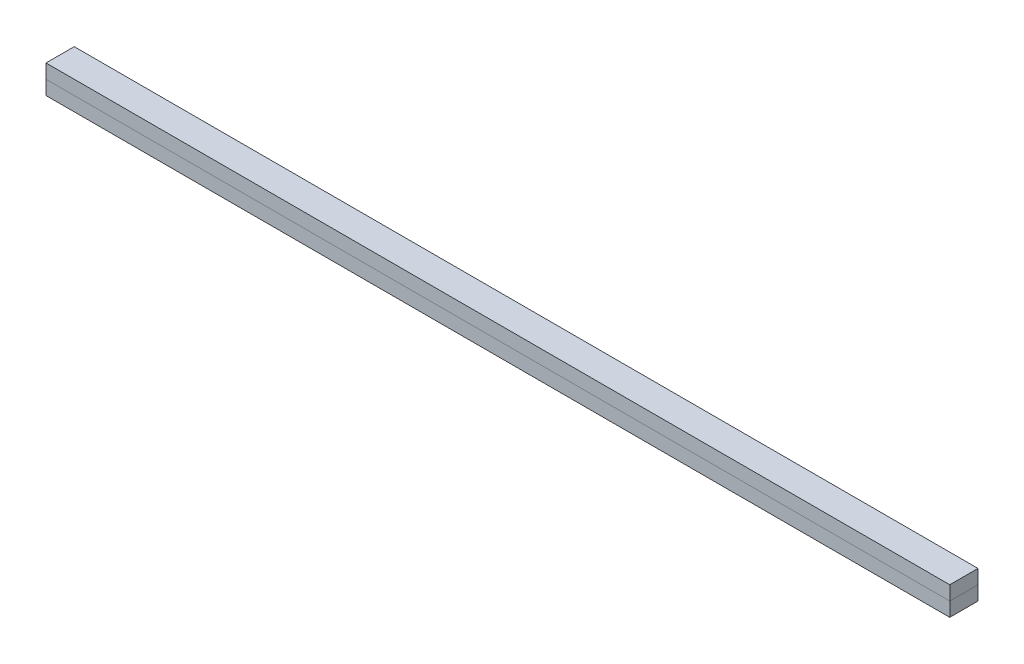
ISO-10303-21;
HEADER;
FILE_DESCRIPTION(('STEP AP214'),'2;1');
FILE_NAME('part.step','',(''),(''),'','','');
FILE_SCHEMA(('AUTOMOTIVE_DESIGN { 1 0 10303 214 1 1 1 1 }'));
ENDSEC;
DATA;
#1=APPLICATION_CONTEXT('core data for automotive mechanical design processes');
#2=APPLICATION_PROTOCOL_DEFINITION('international standard','automotive_design',2000,#1);
#3=PRODUCT_CONTEXT('',#1,'mechanical');
#4=PRODUCT('Part','Part','',(#3));
#5=PRODUCT_RELATED_PRODUCT_CATEGORY('part','',(#4));
#6=PRODUCT_DEFINITION_FORMATION('','',#4);
#7=PRODUCT_DEFINITION_CONTEXT('part definition',#1,'design');
#8=PRODUCT_DEFINITION('design','',#6,#7);
#9=PRODUCT_DEFINITION_SHAPE('','',#8);
#10=(LENGTH_UNIT() NAMED_UNIT(*) SI_UNIT(.MILLI.,.METRE.));
#11=(NAMED_UNIT(*) PLANE_ANGLE_UNIT() SI_UNIT($,.RADIAN.));
#12=(NAMED_UNIT(*) SI_UNIT($,.STERADIAN.) SOLID_ANGLE_UNIT());
#13=UNCERTAINTY_MEASURE_WITH_UNIT(LENGTH_MEASURE(1.E-05),#10,'distance_accuracy_value','');
#14=(GEOMETRIC_REPRESENTATION_CONTEXT(3) GLOBAL_UNCERTAINTY_ASSIGNED_CONTEXT((#13)) GLOBAL_UNIT_ASSIGNED_CONTEXT((#10,
#11,#12)) REPRESENTATION_CONTEXT('',''));
#15=CARTESIAN_POINT('',(0.,0.,0.));
#16=DIRECTION('',(0.,0.,1.));
#17=DIRECTION('',(1.,0.,0.));
#18=AXIS2_PLACEMENT_3D('',#15,#16,#17);
#19=CARTESIAN_POINT('',(0.,-50.,50.));
#20=DIRECTION('',(1.,0.,0.));
#21=DIRECTION('',(0.,0.,-1.));
#22=AXIS2_PLACEMENT_3D('',#19,#20,#21);
#23=PLANE('',#22);
#24=DIRECTION('',(0.,1.,0.));
#25=VECTOR('',#24,1.);
#26=CARTESIAN_POINT('',(0.,0.,-50.));
#27=LINE('',#26,#25);
#28=CARTESIAN_POINT('',(0.,-50.,-50.));
#29=VERTEX_POINT('',#28);
#30=CARTESIAN_POINT('',(0.,0.,-50.));
#31=VERTEX_POINT('',#30);
#32=EDGE_CURVE('E137',#29,#31,#27,.T.);
#33=ORIENTED_EDGE('',*,*,#32,.T.);
#34=DIRECTION('',(0.,0.,1.));
#35=VECTOR('',#34,1.);
#36=CARTESIAN_POINT('',(0.,0.,50.));
#37=LINE('',#36,#35);
#38=CARTESIAN_POINT('',(0.,0.,50.));
#39=VERTEX_POINT('',#38);
#40=EDGE_CURVE('E11',#31,#39,#37,.T.);
#41=ORIENTED_EDGE('',*,*,#40,.T.);
#42=DIRECTION('',(0.,-1.,0.));
#43=VECTOR('',#42,1.);
#44=CARTESIAN_POINT('',(0.,0.,50.));
#45=LINE('',#44,#43);
#46=CARTESIAN_POINT('',(0.,-50.,50.));
#47=VERTEX_POINT('',#46);
#48=EDGE_CURVE('E122',#39,#47,#45,.T.);
#49=ORIENTED_EDGE('',*,*,#48,.T.);
#50=DIRECTION('',(0.,0.,-1.));
#51=VECTOR('',#50,1.);
#52=CARTESIAN_POINT('',(0.,-50.,50.));
#53=LINE('',#52,#51);
#54=EDGE_CURVE('E133',#47,#29,#53,.T.);
#55=ORIENTED_EDGE('',*,*,#54,.T.);
#56=EDGE_LOOP('',(#33,#41,#49,#55));
#57=FACE_BOUND('',#56,.T.);
#58=ADVANCED_FACE('F40',(#57),#23,.T.);
#59=CARTESIAN_POINT('',(-3200.,0.,50.));
#60=DIRECTION('',(0.,0.,1.));
#61=DIRECTION('',(0.,-1.,0.));
#62=AXIS2_PLACEMENT_3D('',#59,#60,#61);
#63=PLANE('',#62);
#64=ORIENTED_EDGE('',*,*,#48,.F.);
#65=DIRECTION('',(-1.,0.,0.));
#66=VECTOR('',#65,1.);
#67=CARTESIAN_POINT('',(-3200.,0.,50.));
#68=LINE('',#67,#66);
#69=CARTESIAN_POINT('',(-3200.,0.,50.));
#70=VERTEX_POINT('',#69);
#71=EDGE_CURVE('E50',#39,#70,#68,.T.);
#72=ORIENTED_EDGE('',*,*,#71,.T.);
#73=DIRECTION('',(0.,-1.,0.));
#74=VECTOR('',#73,1.);
#75=CARTESIAN_POINT('',(-3200.,0.,50.));
#76=LINE('',#75,#74);
#77=CARTESIAN_POINT('',(-3200.,-50.,50.));
#78=VERTEX_POINT('',#77);
#79=EDGE_CURVE('E127',#70,#78,#76,.T.);
#80=ORIENTED_EDGE('',*,*,#79,.T.);
#81=DIRECTION('',(1.,0.,0.));
#82=VECTOR('',#81,1.);
#83=CARTESIAN_POINT('',(-3200.,-50.,50.));
#84=LINE('',#83,#82);
#85=EDGE_CURVE('E130',#78,#47,#84,.T.);
#86=ORIENTED_EDGE('',*,*,#85,.T.);
#87=EDGE_LOOP('',(#64,#72,#80,#86));
#88=FACE_BOUND('',#87,.T.);
#89=ADVANCED_FACE('F166',(#88),#63,.T.);
#90=CARTESIAN_POINT('',(-3200.,0.,-50.));
#91=DIRECTION('',(0.,0.,-1.));
#92=DIRECTION('',(0.,1.,0.));
#93=AXIS2_PLACEMENT_3D('',#90,#91,#92);
#94=PLANE('',#93);
#95=DIRECTION('',(0.,1.,0.));
#96=VECTOR('',#95,1.);
#97=CARTESIAN_POINT('',(-3200.,0.,-50.));
#98=LINE('',#97,#96);
#99=CARTESIAN_POINT('',(-3200.,-50.,-50.));
#100=VERTEX_POINT('',#99);
#101=CARTESIAN_POINT('',(-3200.,0.,-50.));
#102=VERTEX_POINT('',#101);
#103=EDGE_CURVE('E104',#100,#102,#98,.T.);
#104=ORIENTED_EDGE('',*,*,#103,.T.);
#105=DIRECTION('',(1.,0.,0.));
#106=VECTOR('',#105,1.);
#107=CARTESIAN_POINT('',(-3200.,0.,-50.));
#108=LINE('',#107,#106);
#109=EDGE_CURVE('E99',#102,#31,#108,.T.);
#110=ORIENTED_EDGE('',*,*,#109,.T.);
#111=ORIENTED_EDGE('',*,*,#32,.F.);
#112=DIRECTION('',(1.,0.,0.));
#113=VECTOR('',#112,1.);
#114=CARTESIAN_POINT('',(-3200.,-50.,-50.));
#115=LINE('',#114,#113);
#116=EDGE_CURVE('E139',#100,#29,#115,.T.);
#117=ORIENTED_EDGE('',*,*,#116,.F.);
#118=EDGE_LOOP('',(#104,#110,#111,#117));
#119=FACE_BOUND('',#118,.T.);
#120=ADVANCED_FACE('F163',(#119),#94,.T.);
#121=CARTESIAN_POINT('',(-3200.,-50.,50.));
#122=DIRECTION('',(1.,0.,0.));
#123=DIRECTION('',(0.,0.,-1.));
#124=AXIS2_PLACEMENT_3D('',#121,#122,#123);
#125=PLANE('',#124);
#126=DIRECTION('',(0.,0.,1.));
#127=VECTOR('',#126,1.);
#128=CARTESIAN_POINT('',(-3200.,0.,50.));
#129=LINE('',#128,#127);
#130=EDGE_CURVE('E44',#102,#70,#129,.T.);
#131=ORIENTED_EDGE('',*,*,#130,.F.);
#132=ORIENTED_EDGE('',*,*,#103,.F.);
#133=DIRECTION('',(0.,0.,-1.));
#134=VECTOR('',#133,1.);
#135=CARTESIAN_POINT('',(-3200.,-50.,50.));
#136=LINE('',#135,#134);
#137=EDGE_CURVE('E105',#78,#100,#136,.T.);
#138=ORIENTED_EDGE('',*,*,#137,.F.);
#139=ORIENTED_EDGE('',*,*,#79,.F.);
#140=EDGE_LOOP('',(#131,#132,#138,#139));
#141=FACE_BOUND('',#140,.T.);
#142=ADVANCED_FACE('F156',(#141),#125,.F.);
#143=ORIENTED_EDGE('',*,*,#71,.F.);
#144=CARTESIAN_POINT('',(0.,50.,50.));
#145=VERTEX_POINT('',#144);
#146=EDGE_CURVE('E131',#145,#39,#45,.T.);
#147=ORIENTED_EDGE('',*,*,#146,.F.);
#148=DIRECTION('',(1.,0.,0.));
#149=VECTOR('',#148,1.);
#150=CARTESIAN_POINT('',(-3200.,50.,50.));
#151=LINE('',#150,#149);
#152=CARTESIAN_POINT('',(-3200.,50.,50.));
#153=VERTEX_POINT('',#152);
#154=EDGE_CURVE('E120',#153,#145,#151,.T.);
#155=ORIENTED_EDGE('',*,*,#154,.F.);
#156=EDGE_CURVE('E111',#153,#70,#76,.T.);
#157=ORIENTED_EDGE('',*,*,#156,.T.);
#158=EDGE_LOOP('',(#143,#147,#155,#157));
#159=FACE_BOUND('',#158,.T.);
#160=ADVANCED_FACE('F42',(#159),#63,.T.);
#161=ORIENTED_EDGE('',*,*,#109,.F.);
#162=CARTESIAN_POINT('',(-3200.,50.,-50.));
#163=VERTEX_POINT('',#162);
#164=EDGE_CURVE('E93',#102,#163,#98,.T.);
#165=ORIENTED_EDGE('',*,*,#164,.T.);
#166=DIRECTION('',(1.,0.,0.));
#167=VECTOR('',#166,1.);
#168=CARTESIAN_POINT('',(-3200.,50.,-50.));
#169=LINE('',#168,#167);
#170=CARTESIAN_POINT('',(0.,50.,-50.));
#171=VERTEX_POINT('',#170);
#172=EDGE_CURVE('E98',#163,#171,#169,.T.);
#173=ORIENTED_EDGE('',*,*,#172,.T.);
#174=EDGE_CURVE('E136',#31,#171,#27,.T.);
#175=ORIENTED_EDGE('',*,*,#174,.F.);
#176=EDGE_LOOP('',(#161,#165,#173,#175));
#177=FACE_BOUND('',#176,.T.);
#178=ADVANCED_FACE('F95',(#177),#94,.T.);
#179=CARTESIAN_POINT('',(-3200.,-50.,50.));
#180=DIRECTION('',(0.,-1.,0.));
#181=DIRECTION('',(0.,0.,-1.));
#182=AXIS2_PLACEMENT_3D('',#179,#180,#181);
#183=PLANE('',#182);
#184=ORIENTED_EDGE('',*,*,#54,.F.);
#185=ORIENTED_EDGE('',*,*,#85,.F.);
#186=ORIENTED_EDGE('',*,*,#137,.T.);
#187=ORIENTED_EDGE('',*,*,#116,.T.);
#188=EDGE_LOOP('',(#184,#185,#186,#187));
#189=FACE_BOUND('',#188,.T.);
#190=ADVANCED_FACE('F165',(#189),#183,.T.);
#191=ORIENTED_EDGE('',*,*,#164,.F.);
#192=ORIENTED_EDGE('',*,*,#130,.T.);
#193=ORIENTED_EDGE('',*,*,#156,.F.);
#194=DIRECTION('',(0.,0.,-1.));
#195=VECTOR('',#194,1.);
#196=CARTESIAN_POINT('',(-3200.,50.,50.));
#197=LINE('',#196,#195);
#198=EDGE_CURVE('E108',#153,#163,#197,.T.);
#199=ORIENTED_EDGE('',*,*,#198,.T.);
#200=EDGE_LOOP('',(#191,#192,#193,#199));
#201=FACE_BOUND('',#200,.T.);
#202=ADVANCED_FACE('F109',(#201),#125,.F.);
#203=ORIENTED_EDGE('',*,*,#40,.F.);
#204=ORIENTED_EDGE('',*,*,#174,.T.);
#205=DIRECTION('',(0.,0.,-1.));
#206=VECTOR('',#205,1.);
#207=CARTESIAN_POINT('',(0.,50.,50.));
#208=LINE('',#207,#206);
#209=EDGE_CURVE('E115',#145,#171,#208,.T.);
#210=ORIENTED_EDGE('',*,*,#209,.F.);
#211=ORIENTED_EDGE('',*,*,#146,.T.);
#212=EDGE_LOOP('',(#203,#204,#210,#211));
#213=FACE_BOUND('',#212,.T.);
#214=ADVANCED_FACE('F161',(#213),#23,.T.);
#215=CARTESIAN_POINT('',(-3200.,50.,50.));
#216=DIRECTION('',(0.,-1.,0.));
#217=DIRECTION('',(0.,0.,-1.));
#218=AXIS2_PLACEMENT_3D('',#215,#216,#217);
#219=PLANE('',#218);
#220=ORIENTED_EDGE('',*,*,#209,.T.);
#221=ORIENTED_EDGE('',*,*,#172,.F.);
#222=ORIENTED_EDGE('',*,*,#198,.F.);
#223=ORIENTED_EDGE('',*,*,#154,.T.);
#224=EDGE_LOOP('',(#220,#221,#222,#223));
#225=FACE_BOUND('',#224,.T.);
#226=ADVANCED_FACE('F118',(#225),#219,.F.);
#227=CLOSED_SHELL('',(#58,#89,#120,#142,#160,#178,#190,#202,#214,#226));
#228=MANIFOLD_SOLID_BREP('B2',#227);
#229=ADVANCED_BREP_SHAPE_REPRESENTATION('',(#18,#228),#14);
#230=SHAPE_DEFINITION_REPRESENTATION(#9,#229);
ENDSEC;
END-ISO-10303-21;
